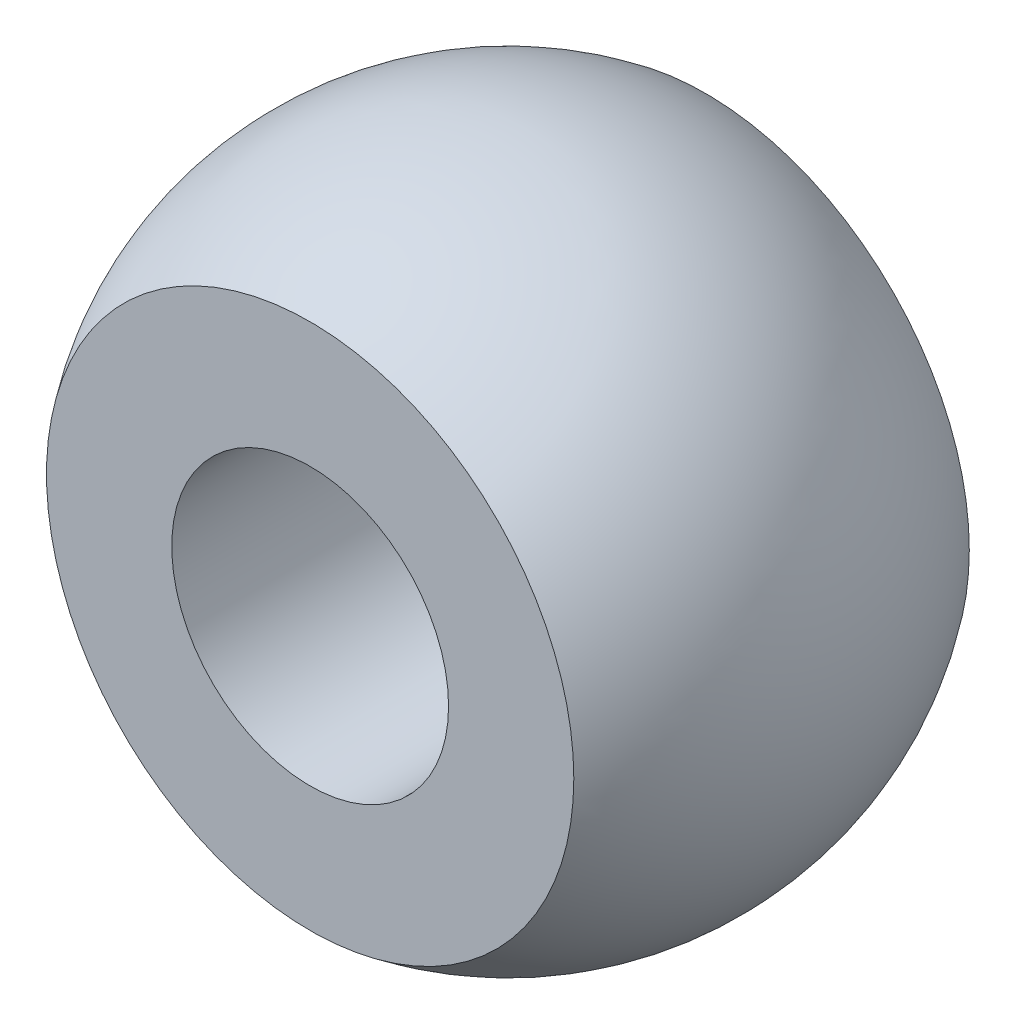
ISO-10303-21;
HEADER;
FILE_DESCRIPTION(('STEP AP214'),'2;1');
FILE_NAME('part.step','',(''),(''),'','','');
FILE_SCHEMA(('AUTOMOTIVE_DESIGN { 1 0 10303 214 1 1 1 1 }'));
ENDSEC;
DATA;
#1=APPLICATION_CONTEXT('core data for automotive mechanical design processes');
#2=APPLICATION_PROTOCOL_DEFINITION('international standard','automotive_design',2000,#1);
#3=PRODUCT_CONTEXT('',#1,'mechanical');
#4=PRODUCT('Part','Part','',(#3));
#5=PRODUCT_RELATED_PRODUCT_CATEGORY('part','',(#4));
#6=PRODUCT_DEFINITION_FORMATION('','',#4);
#7=PRODUCT_DEFINITION_CONTEXT('part definition',#1,'design');
#8=PRODUCT_DEFINITION('design','',#6,#7);
#9=PRODUCT_DEFINITION_SHAPE('','',#8);
#10=(LENGTH_UNIT() NAMED_UNIT(*) SI_UNIT(.MILLI.,.METRE.));
#11=(NAMED_UNIT(*) PLANE_ANGLE_UNIT() SI_UNIT($,.RADIAN.));
#12=(NAMED_UNIT(*) SI_UNIT($,.STERADIAN.) SOLID_ANGLE_UNIT());
#13=UNCERTAINTY_MEASURE_WITH_UNIT(LENGTH_MEASURE(1.E-05),#10,'distance_accuracy_value','');
#14=(GEOMETRIC_REPRESENTATION_CONTEXT(3) GLOBAL_UNCERTAINTY_ASSIGNED_CONTEXT((#13)) GLOBAL_UNIT_ASSIGNED_CONTEXT((#10,
#11,#12)) REPRESENTATION_CONTEXT('',''));
#15=CARTESIAN_POINT('',(0.,0.,0.));
#16=DIRECTION('',(0.,0.,1.));
#17=DIRECTION('',(1.,0.,0.));
#18=AXIS2_PLACEMENT_3D('',#15,#16,#17);
#19=CARTESIAN_POINT('',(0.,0.,0.));
#20=DIRECTION('',(0.,-1.,0.));
#21=DIRECTION('',(1.,0.,0.));
#22=AXIS2_PLACEMENT_3D('',#19,#20,#21);
#23=SPHERICAL_SURFACE('',#22,2.5);
#24=CARTESIAN_POINT('',(0.,0.,0.));
#25=DIRECTION('',(0.,0.,1.));
#26=DIRECTION('',(1.,0.,0.));
#27=AXIS2_PLACEMENT_3D('',#24,#25,#26);
#28=SPHERICAL_SURFACE('',#27,2.5);
#29=CARTESIAN_POINT('',(0.,0.,1.5));
#30=DIRECTION('',(0.,0.,1.));
#31=DIRECTION('',(1.,0.,0.));
#32=AXIS2_PLACEMENT_3D('',#29,#30,#31);
#33=CIRCLE('',#32,2.);
#34=CARTESIAN_POINT('',(2.,0.,1.5));
#35=VERTEX_POINT('',#34);
#36=EDGE_CURVE('E46',#35,#35,#33,.T.);
#37=ORIENTED_EDGE('',*,*,#36,.F.);
#38=EDGE_LOOP('',(#37));
#39=FACE_BOUND('',#38,.T.);
#40=CARTESIAN_POINT('',(0.,0.,-1.5));
#41=DIRECTION('',(0.,0.,1.));
#42=DIRECTION('',(1.,0.,0.));
#43=AXIS2_PLACEMENT_3D('',#40,#41,#42);
#44=CIRCLE('',#43,2.);
#45=CARTESIAN_POINT('',(2.,0.,-1.5));
#46=VERTEX_POINT('',#45);
#47=EDGE_CURVE('E10',#46,#46,#44,.T.);
#48=ORIENTED_EDGE('',*,*,#47,.T.);
#49=EDGE_LOOP('',(#48));
#50=FACE_BOUND('',#49,.T.);
#51=ADVANCED_FACE('F39',(#39,#50),#28,.T.);
#52=CARTESIAN_POINT('',(0.,0.,-1.5));
#53=DIRECTION('',(0.,0.,1.));
#54=DIRECTION('',(1.,0.,0.));
#55=AXIS2_PLACEMENT_3D('',#52,#53,#54);
#56=PLANE('',#55);
#57=CARTESIAN_POINT('',(0.,0.,-1.5));
#58=DIRECTION('',(0.,0.,1.));
#59=DIRECTION('',(1.,0.,0.));
#60=AXIS2_PLACEMENT_3D('',#57,#58,#59);
#61=CIRCLE('',#60,1.05);
#62=CARTESIAN_POINT('',(1.05,0.,-1.5));
#63=VERTEX_POINT('',#62);
#64=EDGE_CURVE('E49',#63,#63,#61,.T.);
#65=ORIENTED_EDGE('',*,*,#64,.T.);
#66=EDGE_LOOP('',(#65));
#67=FACE_BOUND('',#66,.T.);
#68=ORIENTED_EDGE('',*,*,#47,.F.);
#69=EDGE_LOOP('',(#68));
#70=FACE_BOUND('',#69,.T.);
#71=ADVANCED_FACE('F41',(#67,#70),#56,.F.);
#72=CARTESIAN_POINT('',(0.,0.,1.5));
#73=DIRECTION('',(0.,0.,1.));
#74=DIRECTION('',(1.,0.,0.));
#75=AXIS2_PLACEMENT_3D('',#72,#73,#74);
#76=PLANE('',#75);
#77=CARTESIAN_POINT('',(0.,0.,1.5));
#78=DIRECTION('',(0.,0.,1.));
#79=DIRECTION('',(1.,0.,0.));
#80=AXIS2_PLACEMENT_3D('',#77,#78,#79);
#81=CIRCLE('',#80,1.05);
#82=CARTESIAN_POINT('',(1.05,0.,1.5));
#83=VERTEX_POINT('',#82);
#84=EDGE_CURVE('E53',#83,#83,#81,.T.);
#85=ORIENTED_EDGE('',*,*,#84,.F.);
#86=EDGE_LOOP('',(#85));
#87=FACE_BOUND('',#86,.T.);
#88=ORIENTED_EDGE('',*,*,#36,.T.);
#89=EDGE_LOOP('',(#88));
#90=FACE_BOUND('',#89,.T.);
#91=ADVANCED_FACE('F61',(#87,#90),#76,.T.);
#92=CARTESIAN_POINT('',(0.,0.,-1.51));
#93=DIRECTION('',(0.,0.,1.));
#94=DIRECTION('',(1.,0.,0.));
#95=AXIS2_PLACEMENT_3D('',#92,#93,#94);
#96=CYLINDRICAL_SURFACE('',#95,1.05);
#97=ORIENTED_EDGE('',*,*,#84,.T.);
#98=EDGE_LOOP('',(#97));
#99=FACE_BOUND('',#98,.T.);
#100=ORIENTED_EDGE('',*,*,#64,.F.);
#101=EDGE_LOOP('',(#100));
#102=FACE_BOUND('',#101,.T.);
#103=ADVANCED_FACE('F58',(#99,#102),#96,.F.);
#104=CLOSED_SHELL('',(#51,#71,#91,#103));
#105=MANIFOLD_SOLID_BREP('B2',#104);
#106=ADVANCED_BREP_SHAPE_REPRESENTATION('',(#18,#105),#14);
#107=SHAPE_DEFINITION_REPRESENTATION(#9,#106);
ENDSEC;
END-ISO-10303-21;
